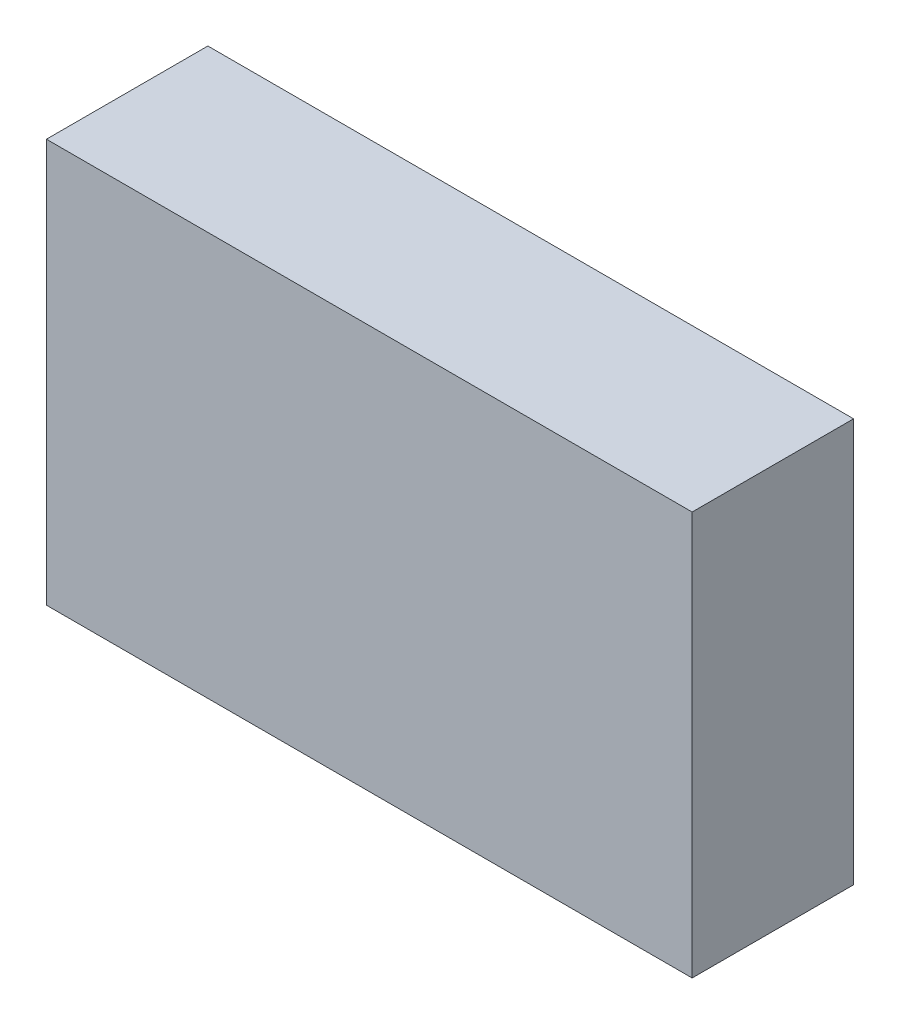
ISO-10303-21;
HEADER;
FILE_DESCRIPTION(('STEP AP214'),'2;1');
FILE_NAME('part.step','',(''),(''),'','','');
FILE_SCHEMA(('AUTOMOTIVE_DESIGN { 1 0 10303 214 1 1 1 1 }'));
ENDSEC;
DATA;
#1=APPLICATION_CONTEXT('core data for automotive mechanical design processes');
#2=APPLICATION_PROTOCOL_DEFINITION('international standard','automotive_design',2000,#1);
#3=PRODUCT_CONTEXT('',#1,'mechanical');
#4=PRODUCT('Part','Part','',(#3));
#5=PRODUCT_RELATED_PRODUCT_CATEGORY('part','',(#4));
#6=PRODUCT_DEFINITION_FORMATION('','',#4);
#7=PRODUCT_DEFINITION_CONTEXT('part definition',#1,'design');
#8=PRODUCT_DEFINITION('design','',#6,#7);
#9=PRODUCT_DEFINITION_SHAPE('','',#8);
#10=(LENGTH_UNIT() NAMED_UNIT(*) SI_UNIT(.MILLI.,.METRE.));
#11=(NAMED_UNIT(*) PLANE_ANGLE_UNIT() SI_UNIT($,.RADIAN.));
#12=(NAMED_UNIT(*) SI_UNIT($,.STERADIAN.) SOLID_ANGLE_UNIT());
#13=UNCERTAINTY_MEASURE_WITH_UNIT(LENGTH_MEASURE(1.E-05),#10,'distance_accuracy_value','');
#14=(GEOMETRIC_REPRESENTATION_CONTEXT(3) GLOBAL_UNCERTAINTY_ASSIGNED_CONTEXT((#13)) GLOBAL_UNIT_ASSIGNED_CONTEXT((#10,
#11,#12)) REPRESENTATION_CONTEXT('',''));
#15=CARTESIAN_POINT('',(0.,0.,0.));
#16=DIRECTION('',(0.,0.,1.));
#17=DIRECTION('',(1.,0.,0.));
#18=AXIS2_PLACEMENT_3D('',#15,#16,#17);
#19=CARTESIAN_POINT('',(0.,0.,0.));
#20=DIRECTION('',(0.,0.,-1.));
#21=DIRECTION('',(-1.,0.,0.));
#22=AXIS2_PLACEMENT_3D('',#19,#20,#21);
#23=PLANE('',#22);
#24=DIRECTION('',(0.,1.,0.));
#25=VECTOR('',#24,1.);
#26=CARTESIAN_POINT('',(40.,-25.,0.));
#27=LINE('',#26,#25);
#28=CARTESIAN_POINT('',(40.,-25.,0.));
#29=VERTEX_POINT('',#28);
#30=CARTESIAN_POINT('',(40.,25.,0.));
#31=VERTEX_POINT('',#30);
#32=EDGE_CURVE('E116',#29,#31,#27,.T.);
#33=ORIENTED_EDGE('',*,*,#32,.F.);
#34=DIRECTION('',(1.,0.,0.));
#35=VECTOR('',#34,1.);
#36=CARTESIAN_POINT('',(-40.,-25.,0.));
#37=LINE('',#36,#35);
#38=CARTESIAN_POINT('',(-40.,-25.,0.));
#39=VERTEX_POINT('',#38);
#40=EDGE_CURVE('E86',#39,#29,#37,.T.);
#41=ORIENTED_EDGE('',*,*,#40,.F.);
#42=DIRECTION('',(0.,-1.,0.));
#43=VECTOR('',#42,1.);
#44=CARTESIAN_POINT('',(-40.,-25.,0.));
#45=LINE('',#44,#43);
#46=CARTESIAN_POINT('',(-40.,25.,0.));
#47=VERTEX_POINT('',#46);
#48=EDGE_CURVE('E137',#47,#39,#45,.T.);
#49=ORIENTED_EDGE('',*,*,#48,.F.);
#50=DIRECTION('',(-1.,0.,0.));
#51=VECTOR('',#50,1.);
#52=CARTESIAN_POINT('',(-40.,25.,0.));
#53=LINE('',#52,#51);
#54=EDGE_CURVE('E135',#31,#47,#53,.T.);
#55=ORIENTED_EDGE('',*,*,#54,.F.);
#56=EDGE_LOOP('',(#33,#41,#49,#55));
#57=FACE_BOUND('',#56,.T.);
#58=DIRECTION('',(1.,0.,0.));
#59=VECTOR('',#58,1.);
#60=CARTESIAN_POINT('',(-15.,-1.5,0.));
#61=LINE('',#60,#59);
#62=CARTESIAN_POINT('',(-15.,-1.5,0.));
#63=VERTEX_POINT('',#62);
#64=CARTESIAN_POINT('',(15.,-1.5,0.));
#65=VERTEX_POINT('',#64);
#66=EDGE_CURVE('E109',#63,#65,#61,.T.);
#67=ORIENTED_EDGE('',*,*,#66,.T.);
#68=DIRECTION('',(0.,-1.,0.));
#69=VECTOR('',#68,1.);
#70=CARTESIAN_POINT('',(15.,1.5,0.));
#71=LINE('',#70,#69);
#72=CARTESIAN_POINT('',(15.,1.5,0.));
#73=VERTEX_POINT('',#72);
#74=EDGE_CURVE('E117',#73,#65,#71,.T.);
#75=ORIENTED_EDGE('',*,*,#74,.F.);
#76=DIRECTION('',(1.,0.,0.));
#77=VECTOR('',#76,1.);
#78=CARTESIAN_POINT('',(-15.,1.5,0.));
#79=LINE('',#78,#77);
#80=CARTESIAN_POINT('',(-15.,1.5,0.));
#81=VERTEX_POINT('',#80);
#82=EDGE_CURVE('E107',#81,#73,#79,.T.);
#83=ORIENTED_EDGE('',*,*,#82,.F.);
#84=DIRECTION('',(0.,-1.,0.));
#85=VECTOR('',#84,1.);
#86=CARTESIAN_POINT('',(-15.,1.5,0.));
#87=LINE('',#86,#85);
#88=EDGE_CURVE('E112',#81,#63,#87,.T.);
#89=ORIENTED_EDGE('',*,*,#88,.T.);
#90=EDGE_LOOP('',(#67,#75,#83,#89));
#91=FACE_BOUND('',#90,.T.);
#92=ADVANCED_FACE('F41',(#57,#91),#23,.T.);
#93=CARTESIAN_POINT('',(40.,-25.,20.));
#94=DIRECTION('',(-1.,0.,0.));
#95=DIRECTION('',(0.,0.,1.));
#96=AXIS2_PLACEMENT_3D('',#93,#94,#95);
#97=PLANE('',#96);
#98=ORIENTED_EDGE('',*,*,#32,.T.);
#99=DIRECTION('',(0.,0.,-1.));
#100=VECTOR('',#99,1.);
#101=CARTESIAN_POINT('',(40.,25.,20.));
#102=LINE('',#101,#100);
#103=CARTESIAN_POINT('',(40.,25.,20.));
#104=VERTEX_POINT('',#103);
#105=EDGE_CURVE('E11',#104,#31,#102,.T.);
#106=ORIENTED_EDGE('',*,*,#105,.F.);
#107=DIRECTION('',(0.,1.,0.));
#108=VECTOR('',#107,1.);
#109=CARTESIAN_POINT('',(40.,-25.,20.));
#110=LINE('',#109,#108);
#111=CARTESIAN_POINT('',(40.,-25.,20.));
#112=VERTEX_POINT('',#111);
#113=EDGE_CURVE('E126',#112,#104,#110,.T.);
#114=ORIENTED_EDGE('',*,*,#113,.F.);
#115=DIRECTION('',(0.,0.,-1.));
#116=VECTOR('',#115,1.);
#117=CARTESIAN_POINT('',(40.,-25.,20.));
#118=LINE('',#117,#116);
#119=EDGE_CURVE('E132',#112,#29,#118,.T.);
#120=ORIENTED_EDGE('',*,*,#119,.T.);
#121=EDGE_LOOP('',(#98,#106,#114,#120));
#122=FACE_BOUND('',#121,.T.);
#123=ADVANCED_FACE('F43',(#122),#97,.F.);
#124=CARTESIAN_POINT('',(-40.,25.,20.));
#125=DIRECTION('',(0.,-1.,0.));
#126=DIRECTION('',(0.,0.,-1.));
#127=AXIS2_PLACEMENT_3D('',#124,#125,#126);
#128=PLANE('',#127);
#129=ORIENTED_EDGE('',*,*,#54,.T.);
#130=DIRECTION('',(0.,0.,-1.));
#131=VECTOR('',#130,1.);
#132=CARTESIAN_POINT('',(-40.,25.,20.));
#133=LINE('',#132,#131);
#134=CARTESIAN_POINT('',(-40.,25.,20.));
#135=VERTEX_POINT('',#134);
#136=EDGE_CURVE('E49',#135,#47,#133,.T.);
#137=ORIENTED_EDGE('',*,*,#136,.F.);
#138=DIRECTION('',(-1.,0.,0.));
#139=VECTOR('',#138,1.);
#140=CARTESIAN_POINT('',(-40.,25.,20.));
#141=LINE('',#140,#139);
#142=EDGE_CURVE('E93',#104,#135,#141,.T.);
#143=ORIENTED_EDGE('',*,*,#142,.F.);
#144=ORIENTED_EDGE('',*,*,#105,.T.);
#145=EDGE_LOOP('',(#129,#137,#143,#144));
#146=FACE_BOUND('',#145,.T.);
#147=ADVANCED_FACE('F162',(#146),#128,.F.);
#148=CARTESIAN_POINT('',(-40.,-25.,20.));
#149=DIRECTION('',(1.,0.,0.));
#150=DIRECTION('',(0.,0.,-1.));
#151=AXIS2_PLACEMENT_3D('',#148,#149,#150);
#152=PLANE('',#151);
#153=ORIENTED_EDGE('',*,*,#48,.T.);
#154=DIRECTION('',(0.,0.,-1.));
#155=VECTOR('',#154,1.);
#156=CARTESIAN_POINT('',(-40.,-25.,20.));
#157=LINE('',#156,#155);
#158=CARTESIAN_POINT('',(-40.,-25.,20.));
#159=VERTEX_POINT('',#158);
#160=EDGE_CURVE('E141',#159,#39,#157,.T.);
#161=ORIENTED_EDGE('',*,*,#160,.F.);
#162=DIRECTION('',(0.,-1.,0.));
#163=VECTOR('',#162,1.);
#164=CARTESIAN_POINT('',(-40.,-25.,20.));
#165=LINE('',#164,#163);
#166=EDGE_CURVE('E129',#135,#159,#165,.T.);
#167=ORIENTED_EDGE('',*,*,#166,.F.);
#168=ORIENTED_EDGE('',*,*,#136,.T.);
#169=EDGE_LOOP('',(#153,#161,#167,#168));
#170=FACE_BOUND('',#169,.T.);
#171=ADVANCED_FACE('F146',(#170),#152,.F.);
#172=CARTESIAN_POINT('',(-40.,-25.,20.));
#173=DIRECTION('',(0.,1.,0.));
#174=DIRECTION('',(0.,0.,1.));
#175=AXIS2_PLACEMENT_3D('',#172,#173,#174);
#176=PLANE('',#175);
#177=ORIENTED_EDGE('',*,*,#40,.T.);
#178=ORIENTED_EDGE('',*,*,#119,.F.);
#179=DIRECTION('',(1.,0.,0.));
#180=VECTOR('',#179,1.);
#181=CARTESIAN_POINT('',(-40.,-25.,20.));
#182=LINE('',#181,#180);
#183=EDGE_CURVE('E65',#159,#112,#182,.T.);
#184=ORIENTED_EDGE('',*,*,#183,.F.);
#185=ORIENTED_EDGE('',*,*,#160,.T.);
#186=EDGE_LOOP('',(#177,#178,#184,#185));
#187=FACE_BOUND('',#186,.T.);
#188=ADVANCED_FACE('F153',(#187),#176,.F.);
#189=CARTESIAN_POINT('',(0.,0.,20.));
#190=DIRECTION('',(0.,0.,-1.));
#191=DIRECTION('',(-1.,0.,0.));
#192=AXIS2_PLACEMENT_3D('',#189,#190,#191);
#193=PLANE('',#192);
#194=ORIENTED_EDGE('',*,*,#113,.T.);
#195=ORIENTED_EDGE('',*,*,#142,.T.);
#196=ORIENTED_EDGE('',*,*,#166,.T.);
#197=ORIENTED_EDGE('',*,*,#183,.T.);
#198=EDGE_LOOP('',(#194,#195,#196,#197));
#199=FACE_BOUND('',#198,.T.);
#200=ADVANCED_FACE('F155',(#199),#193,.F.);
#201=CARTESIAN_POINT('',(0.,1.5,0.));
#202=DIRECTION('',(0.,1.,0.));
#203=DIRECTION('',(0.,0.,1.));
#204=AXIS2_PLACEMENT_3D('',#201,#202,#203);
#205=PLANE('',#204);
#206=CARTESIAN_POINT('',(0.,1.5,0.));
#207=DIRECTION('',(0.,1.,0.));
#208=DIRECTION('',(0.,0.,1.));
#209=AXIS2_PLACEMENT_3D('',#206,#207,#208);
#210=CIRCLE('',#209,15.);
#211=EDGE_CURVE('E103',#73,#81,#210,.T.);
#212=ORIENTED_EDGE('',*,*,#211,.T.);
#213=ORIENTED_EDGE('',*,*,#82,.T.);
#214=EDGE_LOOP('',(#212,#213));
#215=FACE_BOUND('',#214,.T.);
#216=CARTESIAN_POINT('',(0.,1.5,-8.));
#217=DIRECTION('',(0.,1.,0.));
#218=DIRECTION('',(0.,0.,1.));
#219=AXIS2_PLACEMENT_3D('',#216,#217,#218);
#220=CIRCLE('',#219,2.5);
#221=CARTESIAN_POINT('',(0.,1.5,-5.5));
#222=VERTEX_POINT('',#221);
#223=EDGE_CURVE('E124',#222,#222,#220,.T.);
#224=ORIENTED_EDGE('',*,*,#223,.F.);
#225=EDGE_LOOP('',(#224));
#226=FACE_BOUND('',#225,.T.);
#227=ADVANCED_FACE('F104',(#215,#226),#205,.T.);
#228=CARTESIAN_POINT('',(0.,-1.5,0.));
#229=DIRECTION('',(0.,1.,0.));
#230=DIRECTION('',(0.,0.,1.));
#231=AXIS2_PLACEMENT_3D('',#228,#229,#230);
#232=PLANE('',#231);
#233=CARTESIAN_POINT('',(0.,-1.5,0.));
#234=DIRECTION('',(0.,1.,0.));
#235=DIRECTION('',(0.,0.,1.));
#236=AXIS2_PLACEMENT_3D('',#233,#234,#235);
#237=CIRCLE('',#236,15.);
#238=EDGE_CURVE('E56',#65,#63,#237,.T.);
#239=ORIENTED_EDGE('',*,*,#238,.F.);
#240=ORIENTED_EDGE('',*,*,#66,.F.);
#241=EDGE_LOOP('',(#239,#240));
#242=FACE_BOUND('',#241,.T.);
#243=CARTESIAN_POINT('',(0.,-1.5,-8.));
#244=DIRECTION('',(0.,1.,0.));
#245=DIRECTION('',(0.,0.,1.));
#246=AXIS2_PLACEMENT_3D('',#243,#244,#245);
#247=CIRCLE('',#246,2.5);
#248=CARTESIAN_POINT('',(0.,-1.5,-5.5));
#249=VERTEX_POINT('',#248);
#250=EDGE_CURVE('E188',#249,#249,#247,.T.);
#251=ORIENTED_EDGE('',*,*,#250,.T.);
#252=EDGE_LOOP('',(#251));
#253=FACE_BOUND('',#252,.T.);
#254=ADVANCED_FACE('F173',(#242,#253),#232,.F.);
#255=CARTESIAN_POINT('',(0.,1.5,0.));
#256=DIRECTION('',(0.,-1.,0.));
#257=DIRECTION('',(0.,0.,-1.));
#258=AXIS2_PLACEMENT_3D('',#255,#256,#257);
#259=CYLINDRICAL_SURFACE('',#258,15.);
#260=ORIENTED_EDGE('',*,*,#238,.T.);
#261=ORIENTED_EDGE('',*,*,#88,.F.);
#262=ORIENTED_EDGE('',*,*,#211,.F.);
#263=ORIENTED_EDGE('',*,*,#74,.T.);
#264=EDGE_LOOP('',(#260,#261,#262,#263));
#265=FACE_BOUND('',#264,.T.);
#266=ADVANCED_FACE('F113',(#265),#259,.T.);
#267=CARTESIAN_POINT('',(0.,1.5,-8.));
#268=DIRECTION('',(0.,-1.,0.));
#269=DIRECTION('',(0.,0.,-1.));
#270=AXIS2_PLACEMENT_3D('',#267,#268,#269);
#271=CYLINDRICAL_SURFACE('',#270,2.5);
#272=ORIENTED_EDGE('',*,*,#223,.T.);
#273=EDGE_LOOP('',(#272));
#274=FACE_BOUND('',#273,.T.);
#275=ORIENTED_EDGE('',*,*,#250,.F.);
#276=EDGE_LOOP('',(#275));
#277=FACE_BOUND('',#276,.T.);
#278=ADVANCED_FACE('F172',(#274,#277),#271,.F.);
#279=CLOSED_SHELL('',(#92,#123,#147,#171,#188,#200,#227,#254,#266,#278));
#280=MANIFOLD_SOLID_BREP('B2',#279);
#281=ADVANCED_BREP_SHAPE_REPRESENTATION('',(#18,#280),#14);
#282=SHAPE_DEFINITION_REPRESENTATION(#9,#281);
ENDSEC;
END-ISO-10303-21;
